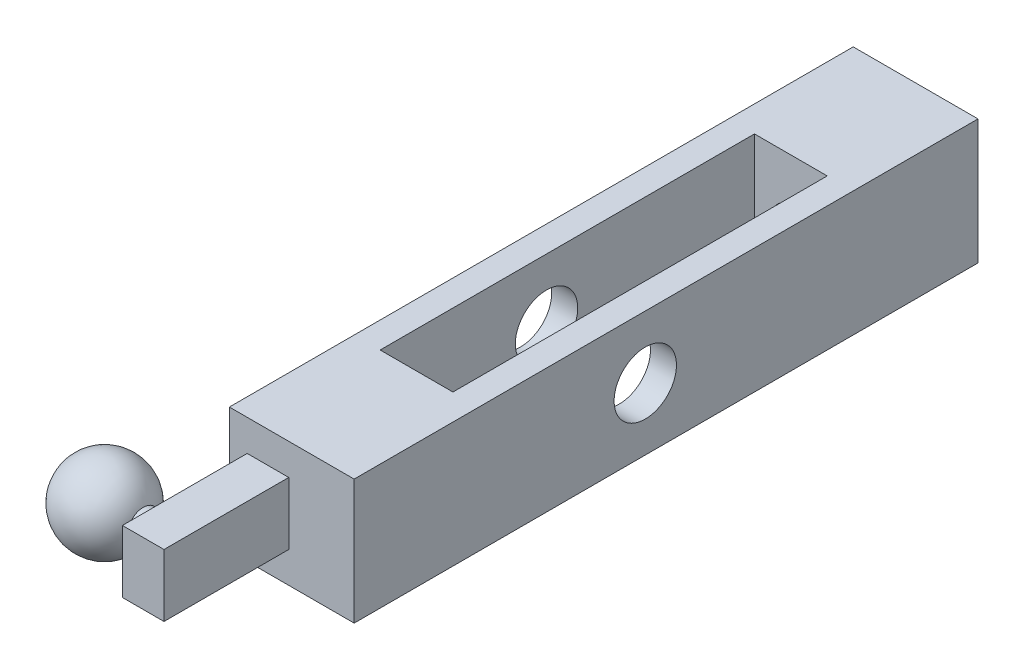
ISO-10303-21;
HEADER;
FILE_DESCRIPTION(('STEP AP214'),'2;1');
FILE_NAME('part.step','',(''),(''),'','','');
FILE_SCHEMA(('AUTOMOTIVE_DESIGN { 1 0 10303 214 1 1 1 1 }'));
ENDSEC;
DATA;
#1=APPLICATION_CONTEXT('core data for automotive mechanical design processes');
#2=APPLICATION_PROTOCOL_DEFINITION('international standard','automotive_design',2000,#1);
#3=PRODUCT_CONTEXT('',#1,'mechanical');
#4=PRODUCT('Part','Part','',(#3));
#5=PRODUCT_RELATED_PRODUCT_CATEGORY('part','',(#4));
#6=PRODUCT_DEFINITION_FORMATION('','',#4);
#7=PRODUCT_DEFINITION_CONTEXT('part definition',#1,'design');
#8=PRODUCT_DEFINITION('design','',#6,#7);
#9=PRODUCT_DEFINITION_SHAPE('','',#8);
#10=(LENGTH_UNIT() NAMED_UNIT(*) SI_UNIT(.MILLI.,.METRE.));
#11=(NAMED_UNIT(*) PLANE_ANGLE_UNIT() SI_UNIT($,.RADIAN.));
#12=(NAMED_UNIT(*) SI_UNIT($,.STERADIAN.) SOLID_ANGLE_UNIT());
#13=UNCERTAINTY_MEASURE_WITH_UNIT(LENGTH_MEASURE(1.E-05),#10,'distance_accuracy_value','');
#14=(GEOMETRIC_REPRESENTATION_CONTEXT(3) GLOBAL_UNCERTAINTY_ASSIGNED_CONTEXT((#13)) GLOBAL_UNIT_ASSIGNED_CONTEXT((#10,
#11,#12)) REPRESENTATION_CONTEXT('',''));
#15=CARTESIAN_POINT('',(0.,0.,0.));
#16=DIRECTION('',(0.,0.,1.));
#17=DIRECTION('',(1.,0.,0.));
#18=AXIS2_PLACEMENT_3D('',#15,#16,#17);
#19=CARTESIAN_POINT('',(3.,-3.,30.));
#20=DIRECTION('',(0.,1.,0.));
#21=DIRECTION('',(-1.,0.,0.));
#22=AXIS2_PLACEMENT_3D('',#19,#20,#21);
#23=PLANE('',#22);
#24=DIRECTION('',(1.,0.,0.));
#25=VECTOR('',#24,1.);
#26=CARTESIAN_POINT('',(3.,-3.,0.));
#27=LINE('',#26,#25);
#28=CARTESIAN_POINT('',(-3.,-3.,0.));
#29=VERTEX_POINT('',#28);
#30=CARTESIAN_POINT('',(3.,-3.,0.));
#31=VERTEX_POINT('',#30);
#32=EDGE_CURVE('E218',#29,#31,#27,.T.);
#33=ORIENTED_EDGE('',*,*,#32,.T.);
#34=DIRECTION('',(0.,0.,-1.));
#35=VECTOR('',#34,1.);
#36=CARTESIAN_POINT('',(3.,-3.,30.));
#37=LINE('',#36,#35);
#38=CARTESIAN_POINT('',(3.,-3.,30.));
#39=VERTEX_POINT('',#38);
#40=EDGE_CURVE('E228',#39,#31,#37,.T.);
#41=ORIENTED_EDGE('',*,*,#40,.F.);
#42=DIRECTION('',(1.,0.,0.));
#43=VECTOR('',#42,1.);
#44=CARTESIAN_POINT('',(3.,-3.,30.));
#45=LINE('',#44,#43);
#46=CARTESIAN_POINT('',(-3.,-3.,30.));
#47=VERTEX_POINT('',#46);
#48=EDGE_CURVE('E208',#47,#39,#45,.T.);
#49=ORIENTED_EDGE('',*,*,#48,.F.);
#50=DIRECTION('',(0.,0.,-1.));
#51=VECTOR('',#50,1.);
#52=CARTESIAN_POINT('',(-3.,-3.,30.));
#53=LINE('',#52,#51);
#54=EDGE_CURVE('E50',#47,#29,#53,.T.);
#55=ORIENTED_EDGE('',*,*,#54,.T.);
#56=EDGE_LOOP('',(#33,#41,#49,#55));
#57=FACE_BOUND('',#56,.T.);
#58=DIRECTION('',(1.,0.,0.));
#59=VECTOR('',#58,1.);
#60=CARTESIAN_POINT('',(3.,-3.,6.00000000000001));
#61=LINE('',#60,#59);
#62=CARTESIAN_POINT('',(-1.75,-3.,6.));
#63=VERTEX_POINT('',#62);
#64=CARTESIAN_POINT('',(1.75,-3.,6.));
#65=VERTEX_POINT('',#64);
#66=EDGE_CURVE('E135',#63,#65,#61,.T.);
#67=ORIENTED_EDGE('',*,*,#66,.F.);
#68=DIRECTION('',(0.,0.,-1.));
#69=VECTOR('',#68,1.);
#70=CARTESIAN_POINT('',(-1.75000000000001,-3.,30.));
#71=LINE('',#70,#69);
#72=CARTESIAN_POINT('',(-1.75000000000001,-3.,24.));
#73=VERTEX_POINT('',#72);
#74=EDGE_CURVE('E138',#73,#63,#71,.T.);
#75=ORIENTED_EDGE('',*,*,#74,.F.);
#76=DIRECTION('',(-1.,0.,0.));
#77=VECTOR('',#76,1.);
#78=CARTESIAN_POINT('',(3.,-3.,24.));
#79=LINE('',#78,#77);
#80=CARTESIAN_POINT('',(1.75,-3.,24.));
#81=VERTEX_POINT('',#80);
#82=EDGE_CURVE('E167',#81,#73,#79,.T.);
#83=ORIENTED_EDGE('',*,*,#82,.F.);
#84=DIRECTION('',(0.,0.,1.));
#85=VECTOR('',#84,1.);
#86=CARTESIAN_POINT('',(1.74999999999999,-3.,30.));
#87=LINE('',#86,#85);
#88=EDGE_CURVE('E169',#65,#81,#87,.T.);
#89=ORIENTED_EDGE('',*,*,#88,.F.);
#90=EDGE_LOOP('',(#67,#75,#83,#89));
#91=FACE_BOUND('',#90,.T.);
#92=ADVANCED_FACE('F41',(#57,#91),#23,.F.);
#93=CARTESIAN_POINT('',(3.,3.,30.));
#94=DIRECTION('',(0.,-1.,0.));
#95=DIRECTION('',(1.,0.,0.));
#96=AXIS2_PLACEMENT_3D('',#93,#94,#95);
#97=PLANE('',#96);
#98=DIRECTION('',(-1.,0.,0.));
#99=VECTOR('',#98,1.);
#100=CARTESIAN_POINT('',(3.,3.,0.));
#101=LINE('',#100,#99);
#102=CARTESIAN_POINT('',(3.,3.,0.));
#103=VERTEX_POINT('',#102);
#104=CARTESIAN_POINT('',(-3.,3.,0.));
#105=VERTEX_POINT('',#104);
#106=EDGE_CURVE('E209',#103,#105,#101,.T.);
#107=ORIENTED_EDGE('',*,*,#106,.T.);
#108=DIRECTION('',(0.,0.,-1.));
#109=VECTOR('',#108,1.);
#110=CARTESIAN_POINT('',(-3.,3.,30.));
#111=LINE('',#110,#109);
#112=CARTESIAN_POINT('',(-3.,3.,30.));
#113=VERTEX_POINT('',#112);
#114=EDGE_CURVE('E215',#113,#105,#111,.T.);
#115=ORIENTED_EDGE('',*,*,#114,.F.);
#116=DIRECTION('',(-1.,0.,0.));
#117=VECTOR('',#116,1.);
#118=CARTESIAN_POINT('',(3.,3.,30.));
#119=LINE('',#118,#117);
#120=CARTESIAN_POINT('',(3.,3.,30.));
#121=VERTEX_POINT('',#120);
#122=EDGE_CURVE('E213',#121,#113,#119,.T.);
#123=ORIENTED_EDGE('',*,*,#122,.F.);
#124=DIRECTION('',(0.,0.,-1.));
#125=VECTOR('',#124,1.);
#126=CARTESIAN_POINT('',(3.,3.,30.));
#127=LINE('',#126,#125);
#128=EDGE_CURVE('E225',#121,#103,#127,.T.);
#129=ORIENTED_EDGE('',*,*,#128,.T.);
#130=EDGE_LOOP('',(#107,#115,#123,#129));
#131=FACE_BOUND('',#130,.T.);
#132=DIRECTION('',(1.,0.,0.));
#133=VECTOR('',#132,1.);
#134=CARTESIAN_POINT('',(-1.75,3.,6.));
#135=LINE('',#134,#133);
#136=CARTESIAN_POINT('',(-1.75,3.,6.00000000000001));
#137=VERTEX_POINT('',#136);
#138=CARTESIAN_POINT('',(1.75,3.,6.));
#139=VERTEX_POINT('',#138);
#140=EDGE_CURVE('E66',#137,#139,#135,.T.);
#141=ORIENTED_EDGE('',*,*,#140,.T.);
#142=DIRECTION('',(0.,0.,1.));
#143=VECTOR('',#142,1.);
#144=CARTESIAN_POINT('',(1.75,3.,6.));
#145=LINE('',#144,#143);
#146=CARTESIAN_POINT('',(1.75,3.,24.));
#147=VERTEX_POINT('',#146);
#148=EDGE_CURVE('E142',#139,#147,#145,.T.);
#149=ORIENTED_EDGE('',*,*,#148,.T.);
#150=DIRECTION('',(-1.,0.,0.));
#151=VECTOR('',#150,1.);
#152=CARTESIAN_POINT('',(-1.75,3.,24.));
#153=LINE('',#152,#151);
#154=CARTESIAN_POINT('',(-1.75,3.,24.));
#155=VERTEX_POINT('',#154);
#156=EDGE_CURVE('E148',#147,#155,#153,.T.);
#157=ORIENTED_EDGE('',*,*,#156,.T.);
#158=DIRECTION('',(0.,0.,-1.));
#159=VECTOR('',#158,1.);
#160=CARTESIAN_POINT('',(-1.75,3.,6.));
#161=LINE('',#160,#159);
#162=EDGE_CURVE('E152',#155,#137,#161,.T.);
#163=ORIENTED_EDGE('',*,*,#162,.T.);
#164=EDGE_LOOP('',(#141,#149,#157,#163));
#165=FACE_BOUND('',#164,.T.);
#166=ADVANCED_FACE('F151',(#131,#165),#97,.F.);
#167=CARTESIAN_POINT('',(0.,0.,30.));
#168=DIRECTION('',(0.,0.,1.));
#169=DIRECTION('',(1.,0.,0.));
#170=AXIS2_PLACEMENT_3D('',#167,#168,#169);
#171=PLANE('',#170);
#172=DIRECTION('',(0.,-1.,0.));
#173=VECTOR('',#172,1.);
#174=CARTESIAN_POINT('',(-3.,-3.,30.));
#175=LINE('',#174,#173);
#176=EDGE_CURVE('E205',#113,#47,#175,.T.);
#177=ORIENTED_EDGE('',*,*,#176,.T.);
#178=ORIENTED_EDGE('',*,*,#48,.T.);
#179=DIRECTION('',(0.,1.,0.));
#180=VECTOR('',#179,1.);
#181=CARTESIAN_POINT('',(3.,-3.,30.));
#182=LINE('',#181,#180);
#183=EDGE_CURVE('E211',#39,#121,#182,.T.);
#184=ORIENTED_EDGE('',*,*,#183,.T.);
#185=ORIENTED_EDGE('',*,*,#122,.T.);
#186=EDGE_LOOP('',(#177,#178,#184,#185));
#187=FACE_BOUND('',#186,.T.);
#188=DIRECTION('',(-1.,0.,0.));
#189=VECTOR('',#188,1.);
#190=CARTESIAN_POINT('',(-2.14479354998716,1.49545918544692,30.));
#191=LINE('',#190,#189);
#192=CARTESIAN_POINT('',(-0.144793549987163,1.49545918544692,30.));
#193=VERTEX_POINT('',#192);
#194=CARTESIAN_POINT('',(-2.14479354998716,1.49545918544692,30.));
#195=VERTEX_POINT('',#194);
#196=EDGE_CURVE('E189',#193,#195,#191,.T.);
#197=ORIENTED_EDGE('',*,*,#196,.F.);
#198=DIRECTION('',(0.,1.,0.));
#199=VECTOR('',#198,1.);
#200=CARTESIAN_POINT('',(-0.144793549987163,1.49545918544692,30.));
#201=LINE('',#200,#199);
#202=CARTESIAN_POINT('',(-0.144793549987163,-1.50454081455308,30.));
#203=VERTEX_POINT('',#202);
#204=EDGE_CURVE('E175',#203,#193,#201,.T.);
#205=ORIENTED_EDGE('',*,*,#204,.F.);
#206=DIRECTION('',(1.,0.,0.));
#207=VECTOR('',#206,1.);
#208=CARTESIAN_POINT('',(-2.14479354998716,-1.50454081455308,30.));
#209=LINE('',#208,#207);
#210=CARTESIAN_POINT('',(-2.14479354998716,-1.50454081455308,30.));
#211=VERTEX_POINT('',#210);
#212=EDGE_CURVE('E180',#211,#203,#209,.T.);
#213=ORIENTED_EDGE('',*,*,#212,.F.);
#214=DIRECTION('',(0.,-1.,0.));
#215=VECTOR('',#214,1.);
#216=CARTESIAN_POINT('',(-2.14479354998716,1.49545918544692,30.));
#217=LINE('',#216,#215);
#218=EDGE_CURVE('E191',#195,#211,#217,.T.);
#219=ORIENTED_EDGE('',*,*,#218,.F.);
#220=EDGE_LOOP('',(#197,#205,#213,#219));
#221=FACE_BOUND('',#220,.T.);
#222=ADVANCED_FACE('F272',(#187,#221),#171,.T.);
#223=CARTESIAN_POINT('',(-3.,-3.,30.));
#224=DIRECTION('',(1.,0.,0.));
#225=DIRECTION('',(0.,0.,-1.));
#226=AXIS2_PLACEMENT_3D('',#223,#224,#225);
#227=PLANE('',#226);
#228=CARTESIAN_POINT('',(-3.,0.,16.));
#229=DIRECTION('',(-1.,0.,0.));
#230=DIRECTION('',(0.,0.,1.));
#231=AXIS2_PLACEMENT_3D('',#228,#229,#230);
#232=CIRCLE('',#231,1.5);
#233=CARTESIAN_POINT('',(-3.,0.,17.5));
#234=VERTEX_POINT('',#233);
#235=EDGE_CURVE('E234',#234,#234,#232,.T.);
#236=ORIENTED_EDGE('',*,*,#235,.F.);
#237=EDGE_LOOP('',(#236));
#238=FACE_BOUND('',#237,.T.);
#239=DIRECTION('',(0.,-1.,0.));
#240=VECTOR('',#239,1.);
#241=CARTESIAN_POINT('',(-3.,-3.,0.));
#242=LINE('',#241,#240);
#243=EDGE_CURVE('E204',#105,#29,#242,.T.);
#244=ORIENTED_EDGE('',*,*,#243,.T.);
#245=ORIENTED_EDGE('',*,*,#54,.F.);
#246=ORIENTED_EDGE('',*,*,#176,.F.);
#247=ORIENTED_EDGE('',*,*,#114,.T.);
#248=EDGE_LOOP('',(#244,#245,#246,#247));
#249=FACE_BOUND('',#248,.T.);
#250=ADVANCED_FACE('F43',(#238,#249),#227,.F.);
#251=CARTESIAN_POINT('',(3.,-3.,30.));
#252=DIRECTION('',(-1.,0.,0.));
#253=DIRECTION('',(0.,0.,1.));
#254=AXIS2_PLACEMENT_3D('',#251,#252,#253);
#255=PLANE('',#254);
#256=CARTESIAN_POINT('',(3.,0.,16.));
#257=DIRECTION('',(-1.,0.,0.));
#258=DIRECTION('',(0.,0.,1.));
#259=AXIS2_PLACEMENT_3D('',#256,#257,#258);
#260=CIRCLE('',#259,1.5);
#261=CARTESIAN_POINT('',(3.,0.,17.5));
#262=VERTEX_POINT('',#261);
#263=EDGE_CURVE('E153',#262,#262,#260,.T.);
#264=ORIENTED_EDGE('',*,*,#263,.T.);
#265=EDGE_LOOP('',(#264));
#266=FACE_BOUND('',#265,.T.);
#267=DIRECTION('',(0.,1.,0.));
#268=VECTOR('',#267,1.);
#269=CARTESIAN_POINT('',(3.,-3.,0.));
#270=LINE('',#269,#268);
#271=EDGE_CURVE('E220',#31,#103,#270,.T.);
#272=ORIENTED_EDGE('',*,*,#271,.T.);
#273=ORIENTED_EDGE('',*,*,#128,.F.);
#274=ORIENTED_EDGE('',*,*,#183,.F.);
#275=ORIENTED_EDGE('',*,*,#40,.T.);
#276=EDGE_LOOP('',(#272,#273,#274,#275));
#277=FACE_BOUND('',#276,.T.);
#278=ADVANCED_FACE('F254',(#266,#277),#255,.F.);
#279=CARTESIAN_POINT('',(0.,0.,0.));
#280=DIRECTION('',(0.,0.,1.));
#281=DIRECTION('',(1.,0.,0.));
#282=AXIS2_PLACEMENT_3D('',#279,#280,#281);
#283=PLANE('',#282);
#284=CARTESIAN_POINT('',(0.,0.,0.));
#285=DIRECTION('',(0.,0.,-1.));
#286=DIRECTION('',(-1.,0.,0.));
#287=AXIS2_PLACEMENT_3D('',#284,#285,#286);
#288=CIRCLE('',#287,0.9);
#289=CARTESIAN_POINT('',(-0.9,0.,0.));
#290=VERTEX_POINT('',#289);
#291=EDGE_CURVE('E243',#290,#290,#288,.T.);
#292=ORIENTED_EDGE('',*,*,#291,.F.);
#293=EDGE_LOOP('',(#292));
#294=FACE_BOUND('',#293,.T.);
#295=ORIENTED_EDGE('',*,*,#243,.F.);
#296=ORIENTED_EDGE('',*,*,#106,.F.);
#297=ORIENTED_EDGE('',*,*,#271,.F.);
#298=ORIENTED_EDGE('',*,*,#32,.F.);
#299=EDGE_LOOP('',(#295,#296,#297,#298));
#300=FACE_BOUND('',#299,.T.);
#301=ADVANCED_FACE('F250',(#294,#300),#283,.F.);
#302=CARTESIAN_POINT('',(-0.144793549987163,1.49545918544692,36.));
#303=DIRECTION('',(-1.,0.,0.));
#304=DIRECTION('',(0.,-1.,0.));
#305=AXIS2_PLACEMENT_3D('',#302,#303,#304);
#306=PLANE('',#305);
#307=ORIENTED_EDGE('',*,*,#204,.T.);
#308=DIRECTION('',(0.,0.,-1.));
#309=VECTOR('',#308,1.);
#310=CARTESIAN_POINT('',(-0.144793549987163,1.49545918544692,36.));
#311=LINE('',#310,#309);
#312=CARTESIAN_POINT('',(-0.144793549987163,1.49545918544692,36.));
#313=VERTEX_POINT('',#312);
#314=EDGE_CURVE('E202',#313,#193,#311,.T.);
#315=ORIENTED_EDGE('',*,*,#314,.F.);
#316=DIRECTION('',(0.,1.,0.));
#317=VECTOR('',#316,1.);
#318=CARTESIAN_POINT('',(-0.144793549987163,1.49545918544692,36.));
#319=LINE('',#318,#317);
#320=CARTESIAN_POINT('',(-0.144793549987163,-1.50454081455308,36.));
#321=VERTEX_POINT('',#320);
#322=EDGE_CURVE('E176',#321,#313,#319,.T.);
#323=ORIENTED_EDGE('',*,*,#322,.F.);
#324=DIRECTION('',(0.,0.,-1.));
#325=VECTOR('',#324,1.);
#326=CARTESIAN_POINT('',(-0.144793549987163,-1.50454081455308,36.));
#327=LINE('',#326,#325);
#328=EDGE_CURVE('E186',#321,#203,#327,.T.);
#329=ORIENTED_EDGE('',*,*,#328,.T.);
#330=EDGE_LOOP('',(#307,#315,#323,#329));
#331=FACE_BOUND('',#330,.T.);
#332=ADVANCED_FACE('F253',(#331),#306,.F.);
#333=CARTESIAN_POINT('',(-2.14479354998716,1.49545918544692,36.));
#334=DIRECTION('',(0.,-1.,0.));
#335=DIRECTION('',(1.,0.,0.));
#336=AXIS2_PLACEMENT_3D('',#333,#334,#335);
#337=PLANE('',#336);
#338=ORIENTED_EDGE('',*,*,#196,.T.);
#339=DIRECTION('',(0.,0.,-1.));
#340=VECTOR('',#339,1.);
#341=CARTESIAN_POINT('',(-2.14479354998716,1.49545918544692,36.));
#342=LINE('',#341,#340);
#343=CARTESIAN_POINT('',(-2.14479354998716,1.49545918544692,36.));
#344=VERTEX_POINT('',#343);
#345=EDGE_CURVE('E199',#344,#195,#342,.T.);
#346=ORIENTED_EDGE('',*,*,#345,.F.);
#347=DIRECTION('',(-1.,0.,0.));
#348=VECTOR('',#347,1.);
#349=CARTESIAN_POINT('',(-2.14479354998716,1.49545918544692,36.));
#350=LINE('',#349,#348);
#351=EDGE_CURVE('E179',#313,#344,#350,.T.);
#352=ORIENTED_EDGE('',*,*,#351,.F.);
#353=ORIENTED_EDGE('',*,*,#314,.T.);
#354=EDGE_LOOP('',(#338,#346,#352,#353));
#355=FACE_BOUND('',#354,.T.);
#356=ADVANCED_FACE('F282',(#355),#337,.F.);
#357=CARTESIAN_POINT('',(-2.14479354998716,1.49545918544692,36.));
#358=DIRECTION('',(1.,0.,0.));
#359=DIRECTION('',(0.,1.,0.));
#360=AXIS2_PLACEMENT_3D('',#357,#358,#359);
#361=PLANE('',#360);
#362=CARTESIAN_POINT('',(-2.14479354998716,0.,34.));
#363=DIRECTION('',(1.,0.,0.));
#364=DIRECTION('',(0.,1.,0.));
#365=AXIS2_PLACEMENT_3D('',#362,#363,#364);
#366=CIRCLE('',#365,0.749999999999999);
#367=CARTESIAN_POINT('',(-2.14479354998716,0.749999999999998,34.));
#368=VERTEX_POINT('',#367);
#369=EDGE_CURVE('E11',#368,#368,#366,.F.);
#370=ORIENTED_EDGE('',*,*,#369,.F.);
#371=EDGE_LOOP('',(#370));
#372=FACE_BOUND('',#371,.T.);
#373=ORIENTED_EDGE('',*,*,#218,.T.);
#374=DIRECTION('',(0.,0.,-1.));
#375=VECTOR('',#374,1.);
#376=CARTESIAN_POINT('',(-2.14479354998716,-1.50454081455308,36.));
#377=LINE('',#376,#375);
#378=CARTESIAN_POINT('',(-2.14479354998716,-1.50454081455308,36.));
#379=VERTEX_POINT('',#378);
#380=EDGE_CURVE('E197',#379,#211,#377,.T.);
#381=ORIENTED_EDGE('',*,*,#380,.F.);
#382=DIRECTION('',(0.,-1.,0.));
#383=VECTOR('',#382,1.);
#384=CARTESIAN_POINT('',(-2.14479354998716,1.49545918544692,36.));
#385=LINE('',#384,#383);
#386=EDGE_CURVE('E182',#344,#379,#385,.T.);
#387=ORIENTED_EDGE('',*,*,#386,.F.);
#388=ORIENTED_EDGE('',*,*,#345,.T.);
#389=EDGE_LOOP('',(#373,#381,#387,#388));
#390=FACE_BOUND('',#389,.T.);
#391=ADVANCED_FACE('F286',(#372,#390),#361,.F.);
#392=CARTESIAN_POINT('',(-2.14479354998716,-1.50454081455308,36.));
#393=DIRECTION('',(0.,1.,0.));
#394=DIRECTION('',(-1.,0.,0.));
#395=AXIS2_PLACEMENT_3D('',#392,#393,#394);
#396=PLANE('',#395);
#397=ORIENTED_EDGE('',*,*,#212,.T.);
#398=ORIENTED_EDGE('',*,*,#328,.F.);
#399=DIRECTION('',(1.,0.,0.));
#400=VECTOR('',#399,1.);
#401=CARTESIAN_POINT('',(-2.14479354998716,-1.50454081455308,36.));
#402=LINE('',#401,#400);
#403=EDGE_CURVE('E184',#379,#321,#402,.T.);
#404=ORIENTED_EDGE('',*,*,#403,.F.);
#405=ORIENTED_EDGE('',*,*,#380,.T.);
#406=EDGE_LOOP('',(#397,#398,#404,#405));
#407=FACE_BOUND('',#406,.T.);
#408=ADVANCED_FACE('F295',(#407),#396,.F.);
#409=CARTESIAN_POINT('',(0.,0.,36.));
#410=DIRECTION('',(0.,0.,1.));
#411=DIRECTION('',(1.,0.,0.));
#412=AXIS2_PLACEMENT_3D('',#409,#410,#411);
#413=PLANE('',#412);
#414=ORIENTED_EDGE('',*,*,#322,.T.);
#415=ORIENTED_EDGE('',*,*,#351,.T.);
#416=ORIENTED_EDGE('',*,*,#386,.T.);
#417=ORIENTED_EDGE('',*,*,#403,.T.);
#418=EDGE_LOOP('',(#414,#415,#416,#417));
#419=FACE_BOUND('',#418,.T.);
#420=ADVANCED_FACE('F290',(#419),#413,.T.);
#421=CARTESIAN_POINT('',(-3.14479354998716,0.,34.));
#422=DIRECTION('',(1.,0.,0.));
#423=DIRECTION('',(0.,1.,0.));
#424=AXIS2_PLACEMENT_3D('',#421,#422,#423);
#425=CYLINDRICAL_SURFACE('',#424,0.749999999999999);
#426=CARTESIAN_POINT('',(-3.14479354998716,0.,34.));
#427=DIRECTION('',(-1.,0.,0.));
#428=DIRECTION('',(0.,-1.,0.));
#429=AXIS2_PLACEMENT_3D('',#426,#427,#428);
#430=CIRCLE('',#429,0.749999999999999);
#431=CARTESIAN_POINT('',(-3.14479354998716,-0.749999999999999,34.));
#432=VERTEX_POINT('',#431);
#433=EDGE_CURVE('E172',#432,#432,#430,.T.);
#434=ORIENTED_EDGE('',*,*,#433,.F.);
#435=EDGE_LOOP('',(#434));
#436=FACE_BOUND('',#435,.T.);
#437=ORIENTED_EDGE('',*,*,#369,.T.);
#438=EDGE_LOOP('',(#437));
#439=FACE_BOUND('',#438,.T.);
#440=ADVANCED_FACE('F302',(#436,#439),#425,.T.);
#441=CARTESIAN_POINT('',(-4.99884317176108,0.,34.));
#442=DIRECTION('',(1.,0.,0.));
#443=DIRECTION('',(0.,0.,-1.));
#444=AXIS2_PLACEMENT_3D('',#441,#442,#443);
#445=SPHERICAL_SURFACE('',#444,2.);
#446=ORIENTED_EDGE('',*,*,#433,.T.);
#447=EDGE_LOOP('',(#446));
#448=FACE_BOUND('',#447,.T.);
#449=ADVANCED_FACE('F360',(#448),#445,.T.);
#450=CARTESIAN_POINT('',(-1.75,-5.,6.));
#451=DIRECTION('',(0.,0.,1.));
#452=DIRECTION('',(1.,0.,0.));
#453=AXIS2_PLACEMENT_3D('',#450,#451,#452);
#454=PLANE('',#453);
#455=CARTESIAN_POINT('',(0.,0.,6.));
#456=DIRECTION('',(0.,0.,1.));
#457=DIRECTION('',(1.,0.,0.));
#458=AXIS2_PLACEMENT_3D('',#455,#456,#457);
#459=CIRCLE('',#458,0.9);
#460=CARTESIAN_POINT('',(0.9,0.,6.));
#461=VERTEX_POINT('',#460);
#462=EDGE_CURVE('E45',#461,#461,#459,.T.);
#463=ORIENTED_EDGE('',*,*,#462,.F.);
#464=EDGE_LOOP('',(#463));
#465=FACE_BOUND('',#464,.T.);
#466=ORIENTED_EDGE('',*,*,#66,.T.);
#467=DIRECTION('',(0.,1.,0.));
#468=VECTOR('',#467,1.);
#469=CARTESIAN_POINT('',(1.75,-5.,6.));
#470=LINE('',#469,#468);
#471=EDGE_CURVE('E131',#65,#139,#470,.T.);
#472=ORIENTED_EDGE('',*,*,#471,.T.);
#473=ORIENTED_EDGE('',*,*,#140,.F.);
#474=DIRECTION('',(0.,1.,0.));
#475=VECTOR('',#474,1.);
#476=CARTESIAN_POINT('',(-1.75,-5.,6.));
#477=LINE('',#476,#475);
#478=EDGE_CURVE('E162',#63,#137,#477,.T.);
#479=ORIENTED_EDGE('',*,*,#478,.F.);
#480=EDGE_LOOP('',(#466,#472,#473,#479));
#481=FACE_BOUND('',#480,.T.);
#482=ADVANCED_FACE('F133',(#465,#481),#454,.T.);
#483=CARTESIAN_POINT('',(1.75,-5.,6.));
#484=DIRECTION('',(-1.,0.,0.));
#485=DIRECTION('',(0.,-1.,0.));
#486=AXIS2_PLACEMENT_3D('',#483,#484,#485);
#487=PLANE('',#486);
#488=CARTESIAN_POINT('',(1.75,0.,16.));
#489=DIRECTION('',(-1.,0.,0.));
#490=DIRECTION('',(0.,-1.,0.));
#491=AXIS2_PLACEMENT_3D('',#488,#489,#490);
#492=CIRCLE('',#491,1.5);
#493=CARTESIAN_POINT('',(1.75,-1.5,16.));
#494=VERTEX_POINT('',#493);
#495=EDGE_CURVE('E156',#494,#494,#492,.T.);
#496=ORIENTED_EDGE('',*,*,#495,.F.);
#497=EDGE_LOOP('',(#496));
#498=FACE_BOUND('',#497,.T.);
#499=ORIENTED_EDGE('',*,*,#88,.T.);
#500=DIRECTION('',(0.,1.,0.));
#501=VECTOR('',#500,1.);
#502=CARTESIAN_POINT('',(1.74999999999999,-5.,24.));
#503=LINE('',#502,#501);
#504=EDGE_CURVE('E139',#81,#147,#503,.T.);
#505=ORIENTED_EDGE('',*,*,#504,.T.);
#506=ORIENTED_EDGE('',*,*,#148,.F.);
#507=ORIENTED_EDGE('',*,*,#471,.F.);
#508=EDGE_LOOP('',(#499,#505,#506,#507));
#509=FACE_BOUND('',#508,.T.);
#510=ADVANCED_FACE('F143',(#498,#509),#487,.T.);
#511=CARTESIAN_POINT('',(-1.75000000000001,-5.,24.));
#512=DIRECTION('',(0.,0.,-1.));
#513=DIRECTION('',(-1.,0.,0.));
#514=AXIS2_PLACEMENT_3D('',#511,#512,#513);
#515=PLANE('',#514);
#516=ORIENTED_EDGE('',*,*,#82,.T.);
#517=DIRECTION('',(0.,1.,0.));
#518=VECTOR('',#517,1.);
#519=CARTESIAN_POINT('',(-1.75000000000001,-5.,24.));
#520=LINE('',#519,#518);
#521=EDGE_CURVE('E58',#73,#155,#520,.T.);
#522=ORIENTED_EDGE('',*,*,#521,.T.);
#523=ORIENTED_EDGE('',*,*,#156,.F.);
#524=ORIENTED_EDGE('',*,*,#504,.F.);
#525=EDGE_LOOP('',(#516,#522,#523,#524));
#526=FACE_BOUND('',#525,.T.);
#527=ADVANCED_FACE('F395',(#526),#515,.T.);
#528=CARTESIAN_POINT('',(-1.75,-5.,6.));
#529=DIRECTION('',(1.,0.,0.));
#530=DIRECTION('',(0.,1.,0.));
#531=AXIS2_PLACEMENT_3D('',#528,#529,#530);
#532=PLANE('',#531);
#533=CARTESIAN_POINT('',(-1.75,0.,16.));
#534=DIRECTION('',(1.,0.,0.));
#535=DIRECTION('',(0.,1.,0.));
#536=AXIS2_PLACEMENT_3D('',#533,#534,#535);
#537=CIRCLE('',#536,1.5);
#538=CARTESIAN_POINT('',(-1.75,1.5,16.));
#539=VERTEX_POINT('',#538);
#540=EDGE_CURVE('E232',#539,#539,#537,.T.);
#541=ORIENTED_EDGE('',*,*,#540,.F.);
#542=EDGE_LOOP('',(#541));
#543=FACE_BOUND('',#542,.T.);
#544=ORIENTED_EDGE('',*,*,#74,.T.);
#545=ORIENTED_EDGE('',*,*,#478,.T.);
#546=ORIENTED_EDGE('',*,*,#162,.F.);
#547=ORIENTED_EDGE('',*,*,#521,.F.);
#548=EDGE_LOOP('',(#544,#545,#546,#547));
#549=FACE_BOUND('',#548,.T.);
#550=ADVANCED_FACE('F403',(#543,#549),#532,.T.);
#551=CARTESIAN_POINT('',(5.,0.,16.));
#552=DIRECTION('',(-1.,0.,0.));
#553=DIRECTION('',(0.,0.,1.));
#554=AXIS2_PLACEMENT_3D('',#551,#552,#553);
#555=CYLINDRICAL_SURFACE('',#554,1.5);
#556=ORIENTED_EDGE('',*,*,#540,.T.);
#557=EDGE_LOOP('',(#556));
#558=FACE_BOUND('',#557,.T.);
#559=ORIENTED_EDGE('',*,*,#235,.T.);
#560=EDGE_LOOP('',(#559));
#561=FACE_BOUND('',#560,.T.);
#562=ADVANCED_FACE('F412',(#558,#561),#555,.F.);
#563=ORIENTED_EDGE('',*,*,#495,.T.);
#564=EDGE_LOOP('',(#563));
#565=FACE_BOUND('',#564,.T.);
#566=ORIENTED_EDGE('',*,*,#263,.F.);
#567=EDGE_LOOP('',(#566));
#568=FACE_BOUND('',#567,.T.);
#569=ADVANCED_FACE('F421',(#565,#568),#555,.F.);
#570=CARTESIAN_POINT('',(0.,0.,8.));
#571=DIRECTION('',(0.,0.,-1.));
#572=DIRECTION('',(-1.,0.,0.));
#573=AXIS2_PLACEMENT_3D('',#570,#571,#572);
#574=CYLINDRICAL_SURFACE('',#573,0.9);
#575=ORIENTED_EDGE('',*,*,#462,.T.);
#576=EDGE_LOOP('',(#575));
#577=FACE_BOUND('',#576,.T.);
#578=ORIENTED_EDGE('',*,*,#291,.T.);
#579=EDGE_LOOP('',(#578));
#580=FACE_BOUND('',#579,.T.);
#581=ADVANCED_FACE('F248',(#577,#580),#574,.F.);
#582=CLOSED_SHELL('',(#92,#166,#222,#250,#278,#301,#332,#356,#391,#408,#420,#440,#449,#482,#510,
#527,#550,#562,#569,#581));
#583=MANIFOLD_SOLID_BREP('B2',#582);
#584=ADVANCED_BREP_SHAPE_REPRESENTATION('',(#18,#583),#14);
#585=SHAPE_DEFINITION_REPRESENTATION(#9,#584);
ENDSEC;
END-ISO-10303-21;
